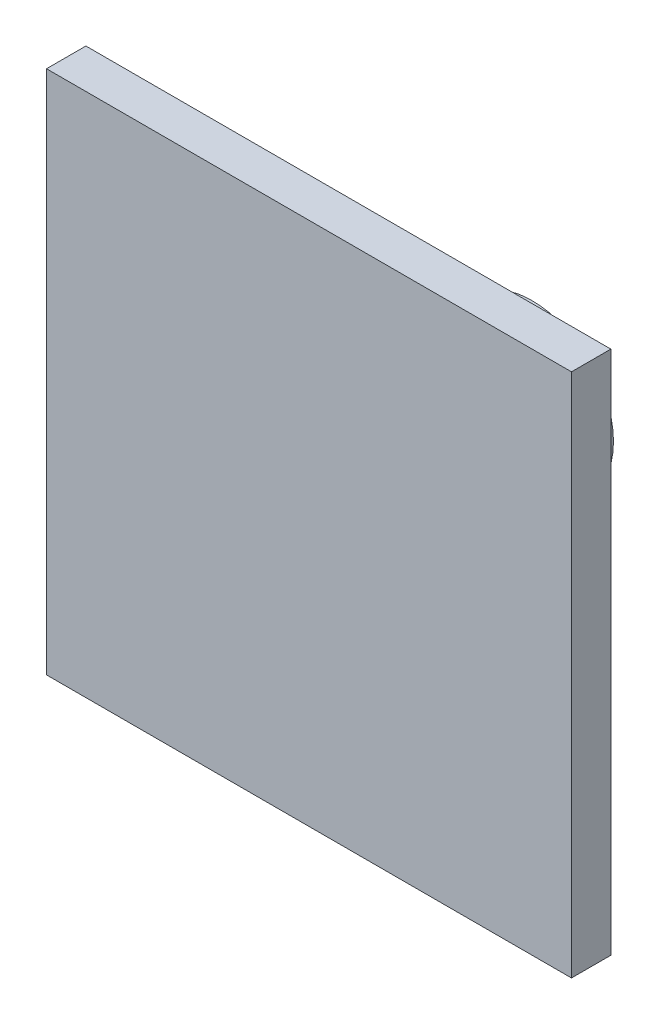
ISO-10303-21;
HEADER;
FILE_DESCRIPTION(('STEP AP214'),'2;1');
FILE_NAME('part.step','',(''),(''),'','','');
FILE_SCHEMA(('AUTOMOTIVE_DESIGN { 1 0 10303 214 1 1 1 1 }'));
ENDSEC;
DATA;
#1=APPLICATION_CONTEXT('core data for automotive mechanical design processes');
#2=APPLICATION_PROTOCOL_DEFINITION('international standard','automotive_design',2000,#1);
#3=PRODUCT_CONTEXT('',#1,'mechanical');
#4=PRODUCT('Part','Part','',(#3));
#5=PRODUCT_RELATED_PRODUCT_CATEGORY('part','',(#4));
#6=PRODUCT_DEFINITION_FORMATION('','',#4);
#7=PRODUCT_DEFINITION_CONTEXT('part definition',#1,'design');
#8=PRODUCT_DEFINITION('design','',#6,#7);
#9=PRODUCT_DEFINITION_SHAPE('','',#8);
#10=(LENGTH_UNIT() NAMED_UNIT(*) SI_UNIT(.MILLI.,.METRE.));
#11=(NAMED_UNIT(*) PLANE_ANGLE_UNIT() SI_UNIT($,.RADIAN.));
#12=(NAMED_UNIT(*) SI_UNIT($,.STERADIAN.) SOLID_ANGLE_UNIT());
#13=UNCERTAINTY_MEASURE_WITH_UNIT(LENGTH_MEASURE(1.E-05),#10,'distance_accuracy_value','');
#14=(GEOMETRIC_REPRESENTATION_CONTEXT(3) GLOBAL_UNCERTAINTY_ASSIGNED_CONTEXT((#13)) GLOBAL_UNIT_ASSIGNED_CONTEXT((#10,
#11,#12)) REPRESENTATION_CONTEXT('',''));
#15=CARTESIAN_POINT('',(0.,0.,0.));
#16=DIRECTION('',(0.,0.,1.));
#17=DIRECTION('',(1.,0.,0.));
#18=AXIS2_PLACEMENT_3D('',#15,#16,#17);
#19=CARTESIAN_POINT('',(10.,-10.,1.5));
#20=DIRECTION('',(-1.,0.,0.));
#21=DIRECTION('',(0.,0.,1.));
#22=AXIS2_PLACEMENT_3D('',#19,#20,#21);
#23=PLANE('',#22);
#24=DIRECTION('',(0.,1.,0.));
#25=VECTOR('',#24,1.);
#26=CARTESIAN_POINT('',(10.,-10.,0.));
#27=LINE('',#26,#25);
#28=CARTESIAN_POINT('',(10.,-10.,0.));
#29=VERTEX_POINT('',#28);
#30=CARTESIAN_POINT('',(10.,10.,0.));
#31=VERTEX_POINT('',#30);
#32=EDGE_CURVE('E101',#29,#31,#27,.T.);
#33=ORIENTED_EDGE('',*,*,#32,.T.);
#34=DIRECTION('',(0.,0.,-1.));
#35=VECTOR('',#34,1.);
#36=CARTESIAN_POINT('',(10.,10.,1.5));
#37=LINE('',#36,#35);
#38=CARTESIAN_POINT('',(10.,10.,1.5));
#39=VERTEX_POINT('',#38);
#40=EDGE_CURVE('E38',#39,#31,#37,.T.);
#41=ORIENTED_EDGE('',*,*,#40,.F.);
#42=DIRECTION('',(0.,1.,0.));
#43=VECTOR('',#42,1.);
#44=CARTESIAN_POINT('',(10.,-10.,1.5));
#45=LINE('',#44,#43);
#46=CARTESIAN_POINT('',(10.,-10.,1.5));
#47=VERTEX_POINT('',#46);
#48=EDGE_CURVE('E88',#47,#39,#45,.T.);
#49=ORIENTED_EDGE('',*,*,#48,.F.);
#50=DIRECTION('',(0.,0.,-1.));
#51=VECTOR('',#50,1.);
#52=CARTESIAN_POINT('',(10.,-10.,1.5));
#53=LINE('',#52,#51);
#54=EDGE_CURVE('E97',#47,#29,#53,.T.);
#55=ORIENTED_EDGE('',*,*,#54,.T.);
#56=EDGE_LOOP('',(#33,#41,#49,#55));
#57=FACE_BOUND('',#56,.T.);
#58=ADVANCED_FACE('F35',(#57),#23,.F.);
#59=CARTESIAN_POINT('',(-10.,10.,1.5));
#60=DIRECTION('',(0.,-1.,0.));
#61=DIRECTION('',(0.,0.,-1.));
#62=AXIS2_PLACEMENT_3D('',#59,#60,#61);
#63=PLANE('',#62);
#64=DIRECTION('',(-1.,0.,0.));
#65=VECTOR('',#64,1.);
#66=CARTESIAN_POINT('',(-10.,10.,0.));
#67=LINE('',#66,#65);
#68=CARTESIAN_POINT('',(-10.,10.,0.));
#69=VERTEX_POINT('',#68);
#70=EDGE_CURVE('E93',#31,#69,#67,.T.);
#71=ORIENTED_EDGE('',*,*,#70,.T.);
#72=DIRECTION('',(0.,0.,-1.));
#73=VECTOR('',#72,1.);
#74=CARTESIAN_POINT('',(-10.,10.,1.5));
#75=LINE('',#74,#73);
#76=CARTESIAN_POINT('',(-10.,10.,1.5));
#77=VERTEX_POINT('',#76);
#78=EDGE_CURVE('E91',#77,#69,#75,.T.);
#79=ORIENTED_EDGE('',*,*,#78,.F.);
#80=DIRECTION('',(-1.,0.,0.));
#81=VECTOR('',#80,1.);
#82=CARTESIAN_POINT('',(-10.,10.,1.5));
#83=LINE('',#82,#81);
#84=EDGE_CURVE('E83',#39,#77,#83,.T.);
#85=ORIENTED_EDGE('',*,*,#84,.F.);
#86=ORIENTED_EDGE('',*,*,#40,.T.);
#87=EDGE_LOOP('',(#71,#79,#85,#86));
#88=FACE_BOUND('',#87,.T.);
#89=ADVANCED_FACE('F92',(#88),#63,.F.);
#90=CARTESIAN_POINT('',(-10.,-10.,1.5));
#91=DIRECTION('',(1.,0.,0.));
#92=DIRECTION('',(0.,0.,-1.));
#93=AXIS2_PLACEMENT_3D('',#90,#91,#92);
#94=PLANE('',#93);
#95=DIRECTION('',(0.,-1.,0.));
#96=VECTOR('',#95,1.);
#97=CARTESIAN_POINT('',(-10.,-10.,0.));
#98=LINE('',#97,#96);
#99=CARTESIAN_POINT('',(-10.,-10.,0.));
#100=VERTEX_POINT('',#99);
#101=EDGE_CURVE('E69',#69,#100,#98,.T.);
#102=ORIENTED_EDGE('',*,*,#101,.T.);
#103=DIRECTION('',(0.,0.,-1.));
#104=VECTOR('',#103,1.);
#105=CARTESIAN_POINT('',(-10.,-10.,1.5));
#106=LINE('',#105,#104);
#107=CARTESIAN_POINT('',(-10.,-10.,1.5));
#108=VERTEX_POINT('',#107);
#109=EDGE_CURVE('E94',#108,#100,#106,.T.);
#110=ORIENTED_EDGE('',*,*,#109,.F.);
#111=DIRECTION('',(0.,-1.,0.));
#112=VECTOR('',#111,1.);
#113=CARTESIAN_POINT('',(-10.,-10.,1.5));
#114=LINE('',#113,#112);
#115=EDGE_CURVE('E86',#77,#108,#114,.T.);
#116=ORIENTED_EDGE('',*,*,#115,.F.);
#117=ORIENTED_EDGE('',*,*,#78,.T.);
#118=EDGE_LOOP('',(#102,#110,#116,#117));
#119=FACE_BOUND('',#118,.T.);
#120=ADVANCED_FACE('F95',(#119),#94,.F.);
#121=CARTESIAN_POINT('',(-10.,-10.,1.5));
#122=DIRECTION('',(0.,1.,0.));
#123=DIRECTION('',(0.,0.,1.));
#124=AXIS2_PLACEMENT_3D('',#121,#122,#123);
#125=PLANE('',#124);
#126=DIRECTION('',(1.,0.,0.));
#127=VECTOR('',#126,1.);
#128=CARTESIAN_POINT('',(-10.,-10.,0.));
#129=LINE('',#128,#127);
#130=EDGE_CURVE('E75',#100,#29,#129,.T.);
#131=ORIENTED_EDGE('',*,*,#130,.T.);
#132=ORIENTED_EDGE('',*,*,#54,.F.);
#133=DIRECTION('',(1.,0.,0.));
#134=VECTOR('',#133,1.);
#135=CARTESIAN_POINT('',(-10.,-10.,1.5));
#136=LINE('',#135,#134);
#137=EDGE_CURVE('E52',#108,#47,#136,.T.);
#138=ORIENTED_EDGE('',*,*,#137,.F.);
#139=ORIENTED_EDGE('',*,*,#109,.T.);
#140=EDGE_LOOP('',(#131,#132,#138,#139));
#141=FACE_BOUND('',#140,.T.);
#142=ADVANCED_FACE('F109',(#141),#125,.F.);
#143=CARTESIAN_POINT('',(0.,0.,1.5));
#144=DIRECTION('',(0.,0.,-1.));
#145=DIRECTION('',(-1.,0.,0.));
#146=AXIS2_PLACEMENT_3D('',#143,#144,#145);
#147=PLANE('',#146);
#148=ORIENTED_EDGE('',*,*,#48,.T.);
#149=ORIENTED_EDGE('',*,*,#84,.T.);
#150=ORIENTED_EDGE('',*,*,#115,.T.);
#151=ORIENTED_EDGE('',*,*,#137,.T.);
#152=EDGE_LOOP('',(#148,#149,#150,#151));
#153=FACE_BOUND('',#152,.T.);
#154=ADVANCED_FACE('F84',(#153),#147,.F.);
#155=CARTESIAN_POINT('',(0.,0.,0.));
#156=DIRECTION('',(0.,0.,-1.));
#157=DIRECTION('',(-1.,0.,0.));
#158=AXIS2_PLACEMENT_3D('',#155,#156,#157);
#159=PLANE('',#158);
#160=CARTESIAN_POINT('',(0.,0.,0.));
#161=DIRECTION('',(0.,0.,1.));
#162=DIRECTION('',(1.,0.,0.));
#163=AXIS2_PLACEMENT_3D('',#160,#161,#162);
#164=CIRCLE('',#163,3.1);
#165=CARTESIAN_POINT('',(3.1,0.,0.));
#166=VERTEX_POINT('',#165);
#167=EDGE_CURVE('E115',#166,#166,#164,.T.);
#168=ORIENTED_EDGE('',*,*,#167,.T.);
#169=EDGE_LOOP('',(#168));
#170=FACE_BOUND('',#169,.T.);
#171=ORIENTED_EDGE('',*,*,#32,.F.);
#172=ORIENTED_EDGE('',*,*,#130,.F.);
#173=ORIENTED_EDGE('',*,*,#101,.F.);
#174=ORIENTED_EDGE('',*,*,#70,.F.);
#175=EDGE_LOOP('',(#171,#172,#173,#174));
#176=FACE_BOUND('',#175,.T.);
#177=ADVANCED_FACE('F112',(#170,#176),#159,.T.);
#178=CARTESIAN_POINT('',(0.,0.,-7.));
#179=DIRECTION('',(0.,0.,1.));
#180=DIRECTION('',(1.,0.,0.));
#181=AXIS2_PLACEMENT_3D('',#178,#179,#180);
#182=CYLINDRICAL_SURFACE('',#181,3.1);
#183=CARTESIAN_POINT('',(0.,0.,-7.));
#184=DIRECTION('',(0.,0.,1.));
#185=DIRECTION('',(1.,0.,0.));
#186=AXIS2_PLACEMENT_3D('',#183,#184,#185);
#187=CIRCLE('',#186,3.1);
#188=CARTESIAN_POINT('',(3.1,0.,-7.));
#189=VERTEX_POINT('',#188);
#190=EDGE_CURVE('E104',#189,#189,#187,.T.);
#191=ORIENTED_EDGE('',*,*,#190,.T.);
#192=EDGE_LOOP('',(#191));
#193=FACE_BOUND('',#192,.T.);
#194=ORIENTED_EDGE('',*,*,#167,.F.);
#195=EDGE_LOOP('',(#194));
#196=FACE_BOUND('',#195,.T.);
#197=ADVANCED_FACE('F141',(#193,#196),#182,.T.);
#198=CARTESIAN_POINT('',(0.,0.,-7.));
#199=DIRECTION('',(0.,0.,1.));
#200=DIRECTION('',(1.,0.,0.));
#201=AXIS2_PLACEMENT_3D('',#198,#199,#200);
#202=PLANE('',#201);
#203=CARTESIAN_POINT('',(0.,0.,-7.));
#204=DIRECTION('',(0.,0.,1.));
#205=DIRECTION('',(1.,0.,0.));
#206=AXIS2_PLACEMENT_3D('',#203,#204,#205);
#207=CIRCLE('',#206,1.1);
#208=CARTESIAN_POINT('',(1.1,0.,-7.));
#209=VERTEX_POINT('',#208);
#210=EDGE_CURVE('E118',#209,#209,#207,.T.);
#211=ORIENTED_EDGE('',*,*,#210,.T.);
#212=EDGE_LOOP('',(#211));
#213=FACE_BOUND('',#212,.T.);
#214=ORIENTED_EDGE('',*,*,#190,.F.);
#215=EDGE_LOOP('',(#214));
#216=FACE_BOUND('',#215,.T.);
#217=ADVANCED_FACE('F124',(#213,#216),#202,.F.);
#218=CARTESIAN_POINT('',(0.,0.,-7.));
#219=DIRECTION('',(0.,0.,1.));
#220=DIRECTION('',(1.,0.,0.));
#221=AXIS2_PLACEMENT_3D('',#218,#219,#220);
#222=CYLINDRICAL_SURFACE('',#221,1.1);
#223=ORIENTED_EDGE('',*,*,#210,.F.);
#224=EDGE_LOOP('',(#223));
#225=FACE_BOUND('',#224,.T.);
#226=CARTESIAN_POINT('',(0.,0.,0.));
#227=DIRECTION('',(0.,0.,1.));
#228=DIRECTION('',(1.,0.,0.));
#229=AXIS2_PLACEMENT_3D('',#226,#227,#228);
#230=CIRCLE('',#229,1.1);
#231=CARTESIAN_POINT('',(1.1,0.,0.));
#232=VERTEX_POINT('',#231);
#233=EDGE_CURVE('E11',#232,#232,#230,.T.);
#234=ORIENTED_EDGE('',*,*,#233,.T.);
#235=EDGE_LOOP('',(#234));
#236=FACE_BOUND('',#235,.T.);
#237=ADVANCED_FACE('F127',(#225,#236),#222,.F.);
#238=ORIENTED_EDGE('',*,*,#233,.F.);
#239=EDGE_LOOP('',(#238));
#240=FACE_BOUND('',#239,.T.);
#241=ADVANCED_FACE('F130',(#240),#159,.T.);
#242=CLOSED_SHELL('',(#58,#89,#120,#142,#154,#177,#197,#217,#237,#241));
#243=MANIFOLD_SOLID_BREP('B2',#242);
#244=ADVANCED_BREP_SHAPE_REPRESENTATION('',(#18,#243),#14);
#245=SHAPE_DEFINITION_REPRESENTATION(#9,#244);
ENDSEC;
END-ISO-10303-21;
